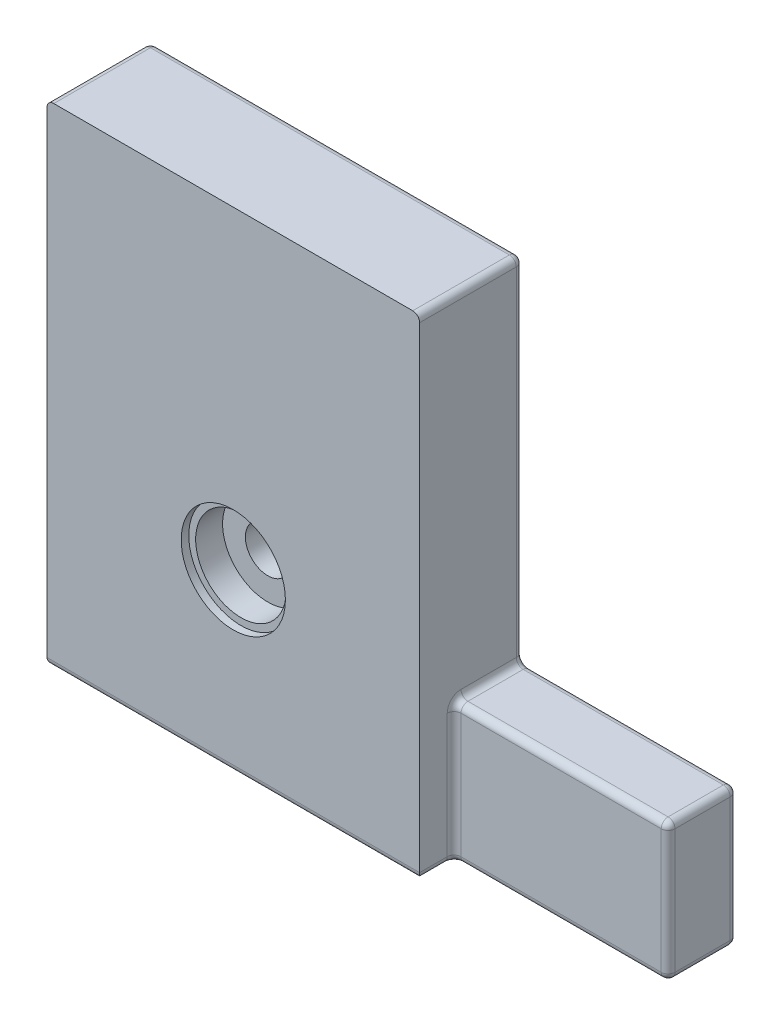
ISO-10303-21;
HEADER;
FILE_DESCRIPTION(('STEP AP214'),'2;1');
FILE_NAME('part.step','',(''),(''),'','','');
FILE_SCHEMA(('AUTOMOTIVE_DESIGN { 1 0 10303 214 1 1 1 1 }'));
ENDSEC;
DATA;
#1=APPLICATION_CONTEXT('core data for automotive mechanical design processes');
#2=APPLICATION_PROTOCOL_DEFINITION('international standard','automotive_design',2000,#1);
#3=PRODUCT_CONTEXT('',#1,'mechanical');
#4=PRODUCT('Part','Part','',(#3));
#5=PRODUCT_RELATED_PRODUCT_CATEGORY('part','',(#4));
#6=PRODUCT_DEFINITION_FORMATION('','',#4);
#7=PRODUCT_DEFINITION_CONTEXT('part definition',#1,'design');
#8=PRODUCT_DEFINITION('design','',#6,#7);
#9=PRODUCT_DEFINITION_SHAPE('','',#8);
#10=(LENGTH_UNIT() NAMED_UNIT(*) SI_UNIT(.MILLI.,.METRE.));
#11=(NAMED_UNIT(*) PLANE_ANGLE_UNIT() SI_UNIT($,.RADIAN.));
#12=(NAMED_UNIT(*) SI_UNIT($,.STERADIAN.) SOLID_ANGLE_UNIT());
#13=UNCERTAINTY_MEASURE_WITH_UNIT(LENGTH_MEASURE(1.E-05),#10,'distance_accuracy_value','');
#14=(GEOMETRIC_REPRESENTATION_CONTEXT(3) GLOBAL_UNCERTAINTY_ASSIGNED_CONTEXT((#13)) GLOBAL_UNIT_ASSIGNED_CONTEXT((#10,
#11,#12)) REPRESENTATION_CONTEXT('',''));
#15=CARTESIAN_POINT('',(0.,0.,0.));
#16=DIRECTION('',(0.,0.,1.));
#17=DIRECTION('',(1.,0.,0.));
#18=AXIS2_PLACEMENT_3D('',#15,#16,#17);
#19=CARTESIAN_POINT('',(30.,-16.5,1.));
#20=DIRECTION('',(1.,0.,0.));
#21=DIRECTION('',(0.,0.,-1.));
#22=AXIS2_PLACEMENT_3D('',#19,#20,#21);
#23=SPHERICAL_SURFACE('',#22,1.);
#24=CARTESIAN_POINT('',(30.,-16.5,0.999999999999999));
#25=DIRECTION('',(0.,0.,-1.));
#26=DIRECTION('',(-1.,0.,0.));
#27=AXIS2_PLACEMENT_3D('',#24,#25,#26);
#28=CIRCLE('',#27,1.);
#29=CARTESIAN_POINT('',(30.,-15.5,0.999999999999999));
#30=VERTEX_POINT('',#29);
#31=CARTESIAN_POINT('',(31.,-16.5,0.999999999999999));
#32=VERTEX_POINT('',#31);
#33=EDGE_CURVE('E282',#30,#32,#28,.T.);
#34=ORIENTED_EDGE('',*,*,#33,.T.);
#35=CARTESIAN_POINT('',(30.,-16.5,0.999999999999999));
#36=DIRECTION('',(0.,1.,0.));
#37=DIRECTION('',(0.,0.,1.));
#38=AXIS2_PLACEMENT_3D('',#35,#36,#37);
#39=CIRCLE('',#38,1.);
#40=CARTESIAN_POINT('',(30.,-16.5,0.));
#41=VERTEX_POINT('',#40);
#42=EDGE_CURVE('E279',#32,#41,#39,.T.);
#43=ORIENTED_EDGE('',*,*,#42,.T.);
#44=CARTESIAN_POINT('',(30.,-16.5,1.));
#45=DIRECTION('',(1.,0.,0.));
#46=DIRECTION('',(0.,0.,-1.));
#47=AXIS2_PLACEMENT_3D('',#44,#45,#46);
#48=CIRCLE('',#47,1.);
#49=EDGE_CURVE('E293',#30,#41,#48,.F.);
#50=ORIENTED_EDGE('',*,*,#49,.F.);
#51=EDGE_LOOP('',(#34,#43,#50));
#52=FACE_BOUND('',#51,.T.);
#53=ADVANCED_FACE('F41',(#52),#23,.T.);
#54=CARTESIAN_POINT('',(30.,-16.5,10.));
#55=DIRECTION('',(0.,0.,-1.));
#56=DIRECTION('',(-1.,0.,0.));
#57=AXIS2_PLACEMENT_3D('',#54,#55,#56);
#58=CYLINDRICAL_SURFACE('',#57,1.);
#59=CARTESIAN_POINT('',(30.,-16.5,9.));
#60=DIRECTION('',(0.,0.,1.));
#61=DIRECTION('',(1.,0.,0.));
#62=AXIS2_PLACEMENT_3D('',#59,#60,#61);
#63=CIRCLE('',#62,1.);
#64=CARTESIAN_POINT('',(31.,-16.5,9.));
#65=VERTEX_POINT('',#64);
#66=CARTESIAN_POINT('',(30.,-15.5,9.));
#67=VERTEX_POINT('',#66);
#68=EDGE_CURVE('E261',#65,#67,#63,.T.);
#69=ORIENTED_EDGE('',*,*,#68,.F.);
#70=DIRECTION('',(0.,0.,-1.));
#71=VECTOR('',#70,1.);
#72=CARTESIAN_POINT('',(31.,-16.5,10.));
#73=LINE('',#72,#71);
#74=EDGE_CURVE('E341',#32,#65,#73,.F.);
#75=ORIENTED_EDGE('',*,*,#74,.F.);
#76=ORIENTED_EDGE('',*,*,#33,.F.);
#77=DIRECTION('',(0.,0.,-1.));
#78=VECTOR('',#77,1.);
#79=CARTESIAN_POINT('',(30.,-15.5,10.));
#80=LINE('',#79,#78);
#81=EDGE_CURVE('E370',#67,#30,#80,.T.);
#82=ORIENTED_EDGE('',*,*,#81,.F.);
#83=EDGE_LOOP('',(#69,#75,#76,#82));
#84=FACE_BOUND('',#83,.T.);
#85=ADVANCED_FACE('F493',(#84),#58,.T.);
#86=CARTESIAN_POINT('',(30.,-16.5,9.));
#87=DIRECTION('',(1.,0.,0.));
#88=DIRECTION('',(0.,0.,-1.));
#89=AXIS2_PLACEMENT_3D('',#86,#87,#88);
#90=SPHERICAL_SURFACE('',#89,1.);
#91=CARTESIAN_POINT('',(30.,-16.5,9.));
#92=DIRECTION('',(0.,1.,0.));
#93=DIRECTION('',(0.,0.,1.));
#94=AXIS2_PLACEMENT_3D('',#91,#92,#93);
#95=CIRCLE('',#94,1.);
#96=CARTESIAN_POINT('',(30.,-16.5,10.));
#97=VERTEX_POINT('',#96);
#98=EDGE_CURVE('E264',#97,#65,#95,.T.);
#99=ORIENTED_EDGE('',*,*,#98,.T.);
#100=ORIENTED_EDGE('',*,*,#68,.T.);
#101=CARTESIAN_POINT('',(30.,-16.5,9.));
#102=DIRECTION('',(1.,0.,0.));
#103=DIRECTION('',(0.,0.,-1.));
#104=AXIS2_PLACEMENT_3D('',#101,#102,#103);
#105=CIRCLE('',#104,1.);
#106=EDGE_CURVE('E285',#97,#67,#105,.F.);
#107=ORIENTED_EDGE('',*,*,#106,.F.);
#108=EDGE_LOOP('',(#99,#100,#107));
#109=FACE_BOUND('',#108,.T.);
#110=ADVANCED_FACE('F504',(#109),#90,.T.);
#111=CARTESIAN_POINT('',(30.,0.,9.));
#112=DIRECTION('',(0.,1.,0.));
#113=DIRECTION('',(-1.,0.,0.));
#114=AXIS2_PLACEMENT_3D('',#111,#112,#113);
#115=CYLINDRICAL_SURFACE('',#114,1.);
#116=CARTESIAN_POINT('',(30.,-34.5,9.));
#117=DIRECTION('',(0.,-1.,0.));
#118=DIRECTION('',(0.,0.,-1.));
#119=AXIS2_PLACEMENT_3D('',#116,#117,#118);
#120=CIRCLE('',#119,1.);
#121=CARTESIAN_POINT('',(30.,-34.5,10.));
#122=VERTEX_POINT('',#121);
#123=CARTESIAN_POINT('',(31.,-34.5,9.));
#124=VERTEX_POINT('',#123);
#125=EDGE_CURVE('E249',#122,#124,#120,.F.);
#126=ORIENTED_EDGE('',*,*,#125,.T.);
#127=DIRECTION('',(0.,1.,0.));
#128=VECTOR('',#127,1.);
#129=CARTESIAN_POINT('',(31.,-15.5,9.));
#130=LINE('',#129,#128);
#131=EDGE_CURVE('E339',#65,#124,#130,.F.);
#132=ORIENTED_EDGE('',*,*,#131,.F.);
#133=ORIENTED_EDGE('',*,*,#98,.F.);
#134=DIRECTION('',(0.,1.,0.));
#135=VECTOR('',#134,1.);
#136=CARTESIAN_POINT('',(30.,0.,10.));
#137=LINE('',#136,#135);
#138=EDGE_CURVE('E361',#122,#97,#137,.T.);
#139=ORIENTED_EDGE('',*,*,#138,.F.);
#140=EDGE_LOOP('',(#126,#132,#133,#139));
#141=FACE_BOUND('',#140,.T.);
#142=ADVANCED_FACE('F507',(#141),#115,.T.);
#143=CARTESIAN_POINT('',(30.,-15.5,0.999999999999999));
#144=DIRECTION('',(0.,-1.,0.));
#145=DIRECTION('',(1.,0.,0.));
#146=AXIS2_PLACEMENT_3D('',#143,#144,#145);
#147=CYLINDRICAL_SURFACE('',#146,1.);
#148=CARTESIAN_POINT('',(30.,-34.5,1.));
#149=DIRECTION('',(0.,-1.,0.));
#150=DIRECTION('',(0.,0.,-1.));
#151=AXIS2_PLACEMENT_3D('',#148,#149,#150);
#152=CIRCLE('',#151,1.);
#153=CARTESIAN_POINT('',(31.,-34.5,0.999999999999999));
#154=VERTEX_POINT('',#153);
#155=CARTESIAN_POINT('',(30.,-34.5,0.));
#156=VERTEX_POINT('',#155);
#157=EDGE_CURVE('E258',#154,#156,#152,.F.);
#158=ORIENTED_EDGE('',*,*,#157,.T.);
#159=DIRECTION('',(0.,1.,0.));
#160=VECTOR('',#159,1.);
#161=CARTESIAN_POINT('',(30.,-35.5,0.));
#162=LINE('',#161,#160);
#163=EDGE_CURVE('E323',#41,#156,#162,.F.);
#164=ORIENTED_EDGE('',*,*,#163,.F.);
#165=ORIENTED_EDGE('',*,*,#42,.F.);
#166=DIRECTION('',(0.,1.,0.));
#167=VECTOR('',#166,1.);
#168=CARTESIAN_POINT('',(31.,-15.5,0.999999999999999));
#169=LINE('',#168,#167);
#170=EDGE_CURVE('E337',#154,#32,#169,.T.);
#171=ORIENTED_EDGE('',*,*,#170,.F.);
#172=EDGE_LOOP('',(#158,#164,#165,#171));
#173=FACE_BOUND('',#172,.T.);
#174=ADVANCED_FACE('F415',(#173),#147,.T.);
#175=CARTESIAN_POINT('',(0.,-16.5,0.999999999999999));
#176=DIRECTION('',(1.,0.,0.));
#177=DIRECTION('',(0.,0.,-1.));
#178=AXIS2_PLACEMENT_3D('',#175,#176,#177);
#179=CYLINDRICAL_SURFACE('',#178,1.);
#180=ORIENTED_EDGE('',*,*,#49,.T.);
#181=DIRECTION('',(-1.,0.,0.));
#182=VECTOR('',#181,1.);
#183=CARTESIAN_POINT('',(31.,-16.5,0.));
#184=LINE('',#183,#182);
#185=CARTESIAN_POINT('',(0.999999999999982,-16.5,0.));
#186=VERTEX_POINT('',#185);
#187=EDGE_CURVE('E319',#186,#41,#184,.F.);
#188=ORIENTED_EDGE('',*,*,#187,.F.);
#189=CARTESIAN_POINT('',(0.999999999999982,-16.5,0.999999999999999));
#190=DIRECTION('',(-1.,0.,0.));
#191=DIRECTION('',(0.,0.,1.));
#192=AXIS2_PLACEMENT_3D('',#189,#190,#191);
#193=CIRCLE('',#192,1.);
#194=CARTESIAN_POINT('',(0.999999999999982,-15.5,0.999999999999999));
#195=VERTEX_POINT('',#194);
#196=EDGE_CURVE('E305',#195,#186,#193,.T.);
#197=ORIENTED_EDGE('',*,*,#196,.F.);
#198=DIRECTION('',(-1.,0.,0.));
#199=VECTOR('',#198,1.);
#200=CARTESIAN_POINT('',(0.,-15.5,0.999999999999999));
#201=LINE('',#200,#199);
#202=EDGE_CURVE('E368',#30,#195,#201,.T.);
#203=ORIENTED_EDGE('',*,*,#202,.F.);
#204=EDGE_LOOP('',(#180,#188,#197,#203));
#205=FACE_BOUND('',#204,.T.);
#206=ADVANCED_FACE('F404',(#205),#179,.T.);
#207=CARTESIAN_POINT('',(-27.,-9.99999999999999,0.));
#208=DIRECTION('',(0.,0.,1.));
#209=DIRECTION('',(1.,0.,0.));
#210=AXIS2_PLACEMENT_3D('',#207,#208,#209);
#211=CYLINDRICAL_SURFACE('',#210,3.25);
#212=CARTESIAN_POINT('',(-27.,-9.99999999999999,10.));
#213=DIRECTION('',(0.,0.,1.));
#214=DIRECTION('',(1.,0.,0.));
#215=AXIS2_PLACEMENT_3D('',#212,#213,#214);
#216=CIRCLE('',#215,3.25);
#217=CARTESIAN_POINT('',(-23.75,-9.99999999999999,10.));
#218=VERTEX_POINT('',#217);
#219=EDGE_CURVE('E216',#218,#218,#216,.T.);
#220=ORIENTED_EDGE('',*,*,#219,.T.);
#221=EDGE_LOOP('',(#220));
#222=FACE_BOUND('',#221,.T.);
#223=CARTESIAN_POINT('',(-27.,-9.99999999999999,0.));
#224=DIRECTION('',(0.,0.,1.));
#225=DIRECTION('',(1.,0.,0.));
#226=AXIS2_PLACEMENT_3D('',#223,#224,#225);
#227=CIRCLE('',#226,3.25);
#228=CARTESIAN_POINT('',(-23.75,-9.99999999999999,0.));
#229=VERTEX_POINT('',#228);
#230=EDGE_CURVE('E220',#229,#229,#227,.T.);
#231=ORIENTED_EDGE('',*,*,#230,.F.);
#232=EDGE_LOOP('',(#231));
#233=FACE_BOUND('',#232,.T.);
#234=ADVANCED_FACE('F401',(#222,#233),#211,.F.);
#235=CARTESIAN_POINT('',(31.,-15.5,10.));
#236=DIRECTION('',(-1.,0.,0.));
#237=DIRECTION('',(0.,-1.,0.));
#238=AXIS2_PLACEMENT_3D('',#235,#236,#237);
#239=PLANE('',#238);
#240=ORIENTED_EDGE('',*,*,#131,.T.);
#241=DIRECTION('',(0.,0.,-1.));
#242=VECTOR('',#241,1.);
#243=CARTESIAN_POINT('',(31.,-34.5,10.));
#244=LINE('',#243,#242);
#245=EDGE_CURVE('E334',#124,#154,#244,.T.);
#246=ORIENTED_EDGE('',*,*,#245,.T.);
#247=ORIENTED_EDGE('',*,*,#170,.T.);
#248=ORIENTED_EDGE('',*,*,#74,.T.);
#249=EDGE_LOOP('',(#240,#246,#247,#248));
#250=FACE_BOUND('',#249,.T.);
#251=ADVANCED_FACE('F403',(#250),#239,.F.);
#252=CARTESIAN_POINT('',(30.,-34.5,9.));
#253=DIRECTION('',(1.,0.,0.));
#254=DIRECTION('',(0.,0.,-1.));
#255=AXIS2_PLACEMENT_3D('',#252,#253,#254);
#256=SPHERICAL_SURFACE('',#255,1.);
#257=CARTESIAN_POINT('',(30.,-34.5,9.));
#258=DIRECTION('',(1.,0.,0.));
#259=DIRECTION('',(0.,0.,-1.));
#260=AXIS2_PLACEMENT_3D('',#257,#258,#259);
#261=CIRCLE('',#260,1.);
#262=CARTESIAN_POINT('',(30.,-35.5,9.));
#263=VERTEX_POINT('',#262);
#264=EDGE_CURVE('E252',#263,#122,#261,.F.);
#265=ORIENTED_EDGE('',*,*,#264,.F.);
#266=CARTESIAN_POINT('',(30.,-34.5,9.));
#267=DIRECTION('',(0.,0.,1.));
#268=DIRECTION('',(1.,0.,0.));
#269=AXIS2_PLACEMENT_3D('',#266,#267,#268);
#270=CIRCLE('',#269,1.);
#271=EDGE_CURVE('E234',#263,#124,#270,.T.);
#272=ORIENTED_EDGE('',*,*,#271,.T.);
#273=ORIENTED_EDGE('',*,*,#125,.F.);
#274=EDGE_LOOP('',(#265,#272,#273));
#275=FACE_BOUND('',#274,.T.);
#276=ADVANCED_FACE('F412',(#275),#256,.T.);
#277=CARTESIAN_POINT('',(30.,-34.5,1.));
#278=DIRECTION('',(0.,-1.,0.));
#279=DIRECTION('',(0.,0.,-1.));
#280=AXIS2_PLACEMENT_3D('',#277,#278,#279);
#281=SPHERICAL_SURFACE('',#280,1.);
#282=CARTESIAN_POINT('',(30.,-34.5,0.999999999999999));
#283=DIRECTION('',(0.,0.,-1.));
#284=DIRECTION('',(-1.,0.,0.));
#285=AXIS2_PLACEMENT_3D('',#282,#283,#284);
#286=CIRCLE('',#285,1.);
#287=CARTESIAN_POINT('',(30.,-35.5,0.999999999999999));
#288=VERTEX_POINT('',#287);
#289=EDGE_CURVE('E246',#154,#288,#286,.T.);
#290=ORIENTED_EDGE('',*,*,#289,.T.);
#291=CARTESIAN_POINT('',(30.,-34.5,0.999999999999999));
#292=DIRECTION('',(1.,0.,0.));
#293=DIRECTION('',(0.,0.,-1.));
#294=AXIS2_PLACEMENT_3D('',#291,#292,#293);
#295=CIRCLE('',#294,1.);
#296=EDGE_CURVE('E243',#288,#156,#295,.T.);
#297=ORIENTED_EDGE('',*,*,#296,.T.);
#298=ORIENTED_EDGE('',*,*,#157,.F.);
#299=EDGE_LOOP('',(#290,#297,#298));
#300=FACE_BOUND('',#299,.T.);
#301=ADVANCED_FACE('F477',(#300),#281,.T.);
#302=CARTESIAN_POINT('',(0.999999999999982,-14.5,0.999999999999999));
#303=DIRECTION('',(0.,0.,-1.));
#304=DIRECTION('',(-1.,0.,0.));
#305=AXIS2_PLACEMENT_3D('',#302,#303,#304);
#306=TOROIDAL_SURFACE('',#305,2.,1.);
#307=CARTESIAN_POINT('',(0.999999999999982,-14.5,0.));
#308=DIRECTION('',(0.,0.,-1.));
#309=DIRECTION('',(-1.,0.,0.));
#310=AXIS2_PLACEMENT_3D('',#307,#308,#309);
#311=CIRCLE('',#310,2.);
#312=CARTESIAN_POINT('',(-1.00000000000002,-14.5,0.));
#313=VERTEX_POINT('',#312);
#314=EDGE_CURVE('E321',#186,#313,#311,.T.);
#315=ORIENTED_EDGE('',*,*,#314,.T.);
#316=CARTESIAN_POINT('',(-1.00000000000002,-14.5,1.));
#317=DIRECTION('',(0.,-1.,0.));
#318=DIRECTION('',(0.,0.,-1.));
#319=AXIS2_PLACEMENT_3D('',#316,#317,#318);
#320=CIRCLE('',#319,1.);
#321=CARTESIAN_POINT('',(0.,-14.5,0.999999999999999));
#322=VERTEX_POINT('',#321);
#323=EDGE_CURVE('E302',#313,#322,#320,.T.);
#324=ORIENTED_EDGE('',*,*,#323,.T.);
#325=CARTESIAN_POINT('',(0.999999999999982,-14.5,0.999999999999999));
#326=DIRECTION('',(0.,0.,-1.));
#327=DIRECTION('',(-1.,0.,0.));
#328=AXIS2_PLACEMENT_3D('',#325,#326,#327);
#329=CIRCLE('',#328,1.);
#330=EDGE_CURVE('E310',#195,#322,#329,.T.);
#331=ORIENTED_EDGE('',*,*,#330,.F.);
#332=ORIENTED_EDGE('',*,*,#196,.T.);
#333=EDGE_LOOP('',(#315,#324,#331,#332));
#334=FACE_BOUND('',#333,.T.);
#335=ADVANCED_FACE('F467',(#334),#306,.T.);
#336=CARTESIAN_POINT('',(0.,-15.5,10.));
#337=DIRECTION('',(0.,-1.,0.));
#338=DIRECTION('',(0.,0.,-1.));
#339=AXIS2_PLACEMENT_3D('',#336,#337,#338);
#340=PLANE('',#339);
#341=ORIENTED_EDGE('',*,*,#202,.T.);
#342=DIRECTION('',(0.,0.,-1.));
#343=VECTOR('',#342,1.);
#344=CARTESIAN_POINT('',(0.999999999999982,-15.5,10.));
#345=LINE('',#344,#343);
#346=CARTESIAN_POINT('',(0.999999999999982,-15.5,9.));
#347=VERTEX_POINT('',#346);
#348=EDGE_CURVE('E365',#195,#347,#345,.F.);
#349=ORIENTED_EDGE('',*,*,#348,.T.);
#350=DIRECTION('',(-1.,0.,0.));
#351=VECTOR('',#350,1.);
#352=CARTESIAN_POINT('',(0.,-15.5,9.));
#353=LINE('',#352,#351);
#354=EDGE_CURVE('E372',#347,#67,#353,.F.);
#355=ORIENTED_EDGE('',*,*,#354,.T.);
#356=ORIENTED_EDGE('',*,*,#81,.T.);
#357=EDGE_LOOP('',(#341,#349,#355,#356));
#358=FACE_BOUND('',#357,.T.);
#359=ADVANCED_FACE('F464',(#358),#340,.F.);
#360=CARTESIAN_POINT('',(0.,-16.5,9.));
#361=DIRECTION('',(-1.,0.,0.));
#362=DIRECTION('',(0.,0.,1.));
#363=AXIS2_PLACEMENT_3D('',#360,#361,#362);
#364=CYLINDRICAL_SURFACE('',#363,1.);
#365=ORIENTED_EDGE('',*,*,#106,.T.);
#366=ORIENTED_EDGE('',*,*,#354,.F.);
#367=CARTESIAN_POINT('',(0.999999999999981,-16.5,9.));
#368=DIRECTION('',(-1.,0.,0.));
#369=DIRECTION('',(0.,-1.,0.));
#370=AXIS2_PLACEMENT_3D('',#367,#368,#369);
#371=CIRCLE('',#370,1.);
#372=CARTESIAN_POINT('',(0.999999999999981,-16.5,10.));
#373=VERTEX_POINT('',#372);
#374=EDGE_CURVE('E296',#373,#347,#371,.T.);
#375=ORIENTED_EDGE('',*,*,#374,.F.);
#376=DIRECTION('',(-1.,0.,0.));
#377=VECTOR('',#376,1.);
#378=CARTESIAN_POINT('',(0.,-16.5,10.));
#379=LINE('',#378,#377);
#380=EDGE_CURVE('E363',#97,#373,#379,.T.);
#381=ORIENTED_EDGE('',*,*,#380,.F.);
#382=EDGE_LOOP('',(#365,#366,#375,#381));
#383=FACE_BOUND('',#382,.T.);
#384=ADVANCED_FACE('F441',(#383),#364,.T.);
#385=CARTESIAN_POINT('',(0.,0.,10.));
#386=DIRECTION('',(0.,0.,-1.));
#387=DIRECTION('',(-1.,0.,0.));
#388=AXIS2_PLACEMENT_3D('',#385,#386,#387);
#389=PLANE('',#388);
#390=ORIENTED_EDGE('',*,*,#380,.T.);
#391=DIRECTION('',(0.,1.,0.));
#392=VECTOR('',#391,1.);
#393=CARTESIAN_POINT('',(0.999999999999974,-35.5,10.));
#394=LINE('',#393,#392);
#395=CARTESIAN_POINT('',(0.999999999999974,-34.5,10.));
#396=VERTEX_POINT('',#395);
#397=EDGE_CURVE('E356',#373,#396,#394,.F.);
#398=ORIENTED_EDGE('',*,*,#397,.T.);
#399=DIRECTION('',(1.,0.,0.));
#400=VECTOR('',#399,1.);
#401=CARTESIAN_POINT('',(0.,-34.5,10.));
#402=LINE('',#401,#400);
#403=EDGE_CURVE('E359',#396,#122,#402,.T.);
#404=ORIENTED_EDGE('',*,*,#403,.T.);
#405=ORIENTED_EDGE('',*,*,#138,.T.);
#406=EDGE_LOOP('',(#390,#398,#404,#405));
#407=FACE_BOUND('',#406,.T.);
#408=ADVANCED_FACE('F438',(#407),#389,.F.);
#409=CARTESIAN_POINT('',(0.,0.,0.));
#410=DIRECTION('',(0.,0.,-1.));
#411=DIRECTION('',(-1.,0.,0.));
#412=AXIS2_PLACEMENT_3D('',#409,#410,#411);
#413=PLANE('',#412);
#414=ORIENTED_EDGE('',*,*,#230,.T.);
#415=EDGE_LOOP('',(#414));
#416=FACE_BOUND('',#415,.T.);
#417=ORIENTED_EDGE('',*,*,#314,.F.);
#418=ORIENTED_EDGE('',*,*,#187,.T.);
#419=ORIENTED_EDGE('',*,*,#163,.T.);
#420=DIRECTION('',(1.,0.,0.));
#421=VECTOR('',#420,1.);
#422=CARTESIAN_POINT('',(-54.,-34.5,0.));
#423=LINE('',#422,#421);
#424=CARTESIAN_POINT('',(-53.,-34.5,0.));
#425=VERTEX_POINT('',#424);
#426=EDGE_CURVE('E328',#156,#425,#423,.F.);
#427=ORIENTED_EDGE('',*,*,#426,.T.);
#428=DIRECTION('',(0.,-1.,0.));
#429=VECTOR('',#428,1.);
#430=CARTESIAN_POINT('',(-53.,35.5,0.));
#431=LINE('',#430,#429);
#432=CARTESIAN_POINT('',(-53.,34.5,0.));
#433=VERTEX_POINT('',#432);
#434=EDGE_CURVE('E330',#425,#433,#431,.F.);
#435=ORIENTED_EDGE('',*,*,#434,.T.);
#436=DIRECTION('',(-1.,0.,0.));
#437=VECTOR('',#436,1.);
#438=CARTESIAN_POINT('',(0.,34.5,0.));
#439=LINE('',#438,#437);
#440=CARTESIAN_POINT('',(-1.,34.5,0.));
#441=VERTEX_POINT('',#440);
#442=EDGE_CURVE('E332',#433,#441,#439,.F.);
#443=ORIENTED_EDGE('',*,*,#442,.T.);
#444=DIRECTION('',(0.,1.,0.));
#445=VECTOR('',#444,1.);
#446=CARTESIAN_POINT('',(-1.00000000000002,-15.5,0.));
#447=LINE('',#446,#445);
#448=EDGE_CURVE('E325',#441,#313,#447,.F.);
#449=ORIENTED_EDGE('',*,*,#448,.T.);
#450=EDGE_LOOP('',(#417,#418,#419,#427,#435,#443,#449));
#451=FACE_BOUND('',#450,.T.);
#452=ADVANCED_FACE('F398',(#416,#451),#413,.T.);
#453=CARTESIAN_POINT('',(0.,-34.5,9.));
#454=DIRECTION('',(1.,0.,0.));
#455=DIRECTION('',(0.,1.,0.));
#456=AXIS2_PLACEMENT_3D('',#453,#454,#455);
#457=CYLINDRICAL_SURFACE('',#456,1.);
#458=ORIENTED_EDGE('',*,*,#264,.T.);
#459=ORIENTED_EDGE('',*,*,#403,.F.);
#460=CARTESIAN_POINT('',(0.999999999999974,-34.5,9.));
#461=DIRECTION('',(-1.,0.,0.));
#462=DIRECTION('',(0.,-1.,0.));
#463=AXIS2_PLACEMENT_3D('',#460,#461,#462);
#464=CIRCLE('',#463,1.);
#465=CARTESIAN_POINT('',(0.999999999999974,-35.5,9.));
#466=VERTEX_POINT('',#465);
#467=EDGE_CURVE('E267',#466,#396,#464,.T.);
#468=ORIENTED_EDGE('',*,*,#467,.F.);
#469=DIRECTION('',(1.,0.,0.));
#470=VECTOR('',#469,1.);
#471=CARTESIAN_POINT('',(31.,-35.5,9.));
#472=LINE('',#471,#470);
#473=EDGE_CURVE('E349',#263,#466,#472,.F.);
#474=ORIENTED_EDGE('',*,*,#473,.F.);
#475=EDGE_LOOP('',(#458,#459,#468,#474));
#476=FACE_BOUND('',#475,.T.);
#477=ADVANCED_FACE('F444',(#476),#457,.T.);
#478=CARTESIAN_POINT('',(30.,-34.5,10.));
#479=DIRECTION('',(0.,0.,-1.));
#480=DIRECTION('',(-1.,0.,0.));
#481=AXIS2_PLACEMENT_3D('',#478,#479,#480);
#482=CYLINDRICAL_SURFACE('',#481,1.);
#483=ORIENTED_EDGE('',*,*,#271,.F.);
#484=DIRECTION('',(0.,0.,-1.));
#485=VECTOR('',#484,1.);
#486=CARTESIAN_POINT('',(30.,-35.5,10.));
#487=LINE('',#486,#485);
#488=EDGE_CURVE('E351',#288,#263,#487,.F.);
#489=ORIENTED_EDGE('',*,*,#488,.F.);
#490=ORIENTED_EDGE('',*,*,#289,.F.);
#491=ORIENTED_EDGE('',*,*,#245,.F.);
#492=EDGE_LOOP('',(#483,#489,#490,#491));
#493=FACE_BOUND('',#492,.T.);
#494=ADVANCED_FACE('F527',(#493),#482,.T.);
#495=CARTESIAN_POINT('',(31.,-34.5,0.999999999999999));
#496=DIRECTION('',(-1.,0.,0.));
#497=DIRECTION('',(0.,-1.,0.));
#498=AXIS2_PLACEMENT_3D('',#495,#496,#497);
#499=CYLINDRICAL_SURFACE('',#498,1.);
#500=CARTESIAN_POINT('',(-53.,-34.5,1.));
#501=DIRECTION('',(-1.,0.,0.));
#502=DIRECTION('',(0.,-1.,0.));
#503=AXIS2_PLACEMENT_3D('',#500,#501,#502);
#504=CIRCLE('',#503,1.);
#505=CARTESIAN_POINT('',(-53.,-35.5,0.999999999999999));
#506=VERTEX_POINT('',#505);
#507=EDGE_CURVE('E231',#506,#425,#504,.F.);
#508=ORIENTED_EDGE('',*,*,#507,.T.);
#509=ORIENTED_EDGE('',*,*,#426,.F.);
#510=ORIENTED_EDGE('',*,*,#296,.F.);
#511=DIRECTION('',(1.,0.,0.));
#512=VECTOR('',#511,1.);
#513=CARTESIAN_POINT('',(31.,-35.5,0.999999999999999));
#514=LINE('',#513,#512);
#515=EDGE_CURVE('E353',#506,#288,#514,.T.);
#516=ORIENTED_EDGE('',*,*,#515,.F.);
#517=EDGE_LOOP('',(#508,#509,#510,#516));
#518=FACE_BOUND('',#517,.T.);
#519=ADVANCED_FACE('F543',(#518),#499,.T.);
#520=CARTESIAN_POINT('',(-53.,-34.5,1.));
#521=DIRECTION('',(-1.,0.,0.));
#522=DIRECTION('',(0.,0.,1.));
#523=AXIS2_PLACEMENT_3D('',#520,#521,#522);
#524=SPHERICAL_SURFACE('',#523,1.);
#525=ORIENTED_EDGE('',*,*,#507,.F.);
#526=CARTESIAN_POINT('',(-53.,-34.5,0.999999999999999));
#527=DIRECTION('',(0.,0.,-1.));
#528=DIRECTION('',(-1.,0.,0.));
#529=AXIS2_PLACEMENT_3D('',#526,#527,#528);
#530=CIRCLE('',#529,1.);
#531=CARTESIAN_POINT('',(-54.,-34.5,0.999999999999999));
#532=VERTEX_POINT('',#531);
#533=EDGE_CURVE('E225',#506,#532,#530,.T.);
#534=ORIENTED_EDGE('',*,*,#533,.T.);
#535=CARTESIAN_POINT('',(-53.,-34.5,0.999999999999999));
#536=DIRECTION('',(0.,-1.,0.));
#537=DIRECTION('',(0.,0.,-1.));
#538=AXIS2_PLACEMENT_3D('',#535,#536,#537);
#539=CIRCLE('',#538,1.);
#540=EDGE_CURVE('E228',#425,#532,#539,.F.);
#541=ORIENTED_EDGE('',*,*,#540,.F.);
#542=EDGE_LOOP('',(#525,#534,#541));
#543=FACE_BOUND('',#542,.T.);
#544=ADVANCED_FACE('F502',(#543),#524,.T.);
#545=CARTESIAN_POINT('',(0.999999999999974,-34.5,11.));
#546=DIRECTION('',(0.,1.,0.));
#547=DIRECTION('',(-1.,0.,0.));
#548=AXIS2_PLACEMENT_3D('',#545,#546,#547);
#549=TOROIDAL_SURFACE('',#548,2.,1.);
#550=CARTESIAN_POINT('',(0.999999999999974,-35.5,11.));
#551=DIRECTION('',(0.,1.,0.));
#552=DIRECTION('',(-1.,0.,0.));
#553=AXIS2_PLACEMENT_3D('',#550,#551,#552);
#554=CIRCLE('',#553,2.);
#555=CARTESIAN_POINT('',(-1.00000000000003,-35.5,11.));
#556=VERTEX_POINT('',#555);
#557=EDGE_CURVE('E346',#556,#466,#554,.F.);
#558=ORIENTED_EDGE('',*,*,#557,.T.);
#559=ORIENTED_EDGE('',*,*,#467,.T.);
#560=CARTESIAN_POINT('',(0.999999999999974,-34.5,11.));
#561=DIRECTION('',(0.,1.,0.));
#562=DIRECTION('',(-1.,0.,0.));
#563=AXIS2_PLACEMENT_3D('',#560,#561,#562);
#564=CIRCLE('',#563,1.);
#565=CARTESIAN_POINT('',(0.,-34.5,11.));
#566=VERTEX_POINT('',#565);
#567=EDGE_CURVE('E288',#566,#396,#564,.F.);
#568=ORIENTED_EDGE('',*,*,#567,.F.);
#569=CARTESIAN_POINT('',(-1.00000000000003,-34.5,11.));
#570=DIRECTION('',(0.,0.,-1.));
#571=DIRECTION('',(-1.,0.,0.));
#572=AXIS2_PLACEMENT_3D('',#569,#570,#571);
#573=CIRCLE('',#572,1.);
#574=EDGE_CURVE('E270',#566,#556,#573,.T.);
#575=ORIENTED_EDGE('',*,*,#574,.T.);
#576=EDGE_LOOP('',(#558,#559,#568,#575));
#577=FACE_BOUND('',#576,.T.);
#578=ADVANCED_FACE('F498',(#577),#549,.T.);
#579=CARTESIAN_POINT('',(0.,34.5,0.999999999999999));
#580=DIRECTION('',(1.,0.,0.));
#581=DIRECTION('',(0.,1.,0.));
#582=AXIS2_PLACEMENT_3D('',#579,#580,#581);
#583=CYLINDRICAL_SURFACE('',#582,1.);
#584=CARTESIAN_POINT('',(-53.,34.5,0.999999999999999));
#585=DIRECTION('',(-1.,0.,0.));
#586=DIRECTION('',(0.,0.,1.));
#587=AXIS2_PLACEMENT_3D('',#584,#585,#586);
#588=CIRCLE('',#587,1.);
#589=CARTESIAN_POINT('',(-53.,35.5,0.999999999999999));
#590=VERTEX_POINT('',#589);
#591=EDGE_CURVE('E255',#433,#590,#588,.F.);
#592=ORIENTED_EDGE('',*,*,#591,.T.);
#593=DIRECTION('',(-1.,0.,0.));
#594=VECTOR('',#593,1.);
#595=CARTESIAN_POINT('',(-54.,35.5,0.999999999999999));
#596=LINE('',#595,#594);
#597=CARTESIAN_POINT('',(-1.,35.5,0.999999999999999));
#598=VERTEX_POINT('',#597);
#599=EDGE_CURVE('E206',#598,#590,#596,.T.);
#600=ORIENTED_EDGE('',*,*,#599,.F.);
#601=CARTESIAN_POINT('',(-1.,34.5,1.));
#602=DIRECTION('',(1.,0.,0.));
#603=DIRECTION('',(0.,1.,0.));
#604=AXIS2_PLACEMENT_3D('',#601,#602,#603);
#605=CIRCLE('',#604,1.);
#606=EDGE_CURVE('E276',#441,#598,#605,.T.);
#607=ORIENTED_EDGE('',*,*,#606,.F.);
#608=ORIENTED_EDGE('',*,*,#442,.F.);
#609=EDGE_LOOP('',(#592,#600,#607,#608));
#610=FACE_BOUND('',#609,.T.);
#611=ADVANCED_FACE('F501',(#610),#583,.T.);
#612=CARTESIAN_POINT('',(-53.,34.5,1.));
#613=DIRECTION('',(-1.,0.,0.));
#614=DIRECTION('',(0.,0.,1.));
#615=AXIS2_PLACEMENT_3D('',#612,#613,#614);
#616=SPHERICAL_SURFACE('',#615,1.);
#617=CARTESIAN_POINT('',(-53.,34.5,1.));
#618=DIRECTION('',(0.,1.,0.));
#619=DIRECTION('',(0.,0.,1.));
#620=AXIS2_PLACEMENT_3D('',#617,#618,#619);
#621=CIRCLE('',#620,1.);
#622=CARTESIAN_POINT('',(-54.,34.5,0.999999999999999));
#623=VERTEX_POINT('',#622);
#624=EDGE_CURVE('E240',#433,#623,#621,.T.);
#625=ORIENTED_EDGE('',*,*,#624,.T.);
#626=CARTESIAN_POINT('',(-53.,34.5,0.999999999999999));
#627=DIRECTION('',(0.,0.,-1.));
#628=DIRECTION('',(-1.,0.,0.));
#629=AXIS2_PLACEMENT_3D('',#626,#627,#628);
#630=CIRCLE('',#629,1.);
#631=EDGE_CURVE('E237',#623,#590,#630,.T.);
#632=ORIENTED_EDGE('',*,*,#631,.T.);
#633=ORIENTED_EDGE('',*,*,#591,.F.);
#634=EDGE_LOOP('',(#625,#632,#633));
#635=FACE_BOUND('',#634,.T.);
#636=ADVANCED_FACE('F459',(#635),#616,.T.);
#637=CARTESIAN_POINT('',(0.,35.5,10.));
#638=DIRECTION('',(0.,-1.,0.));
#639=DIRECTION('',(1.,0.,0.));
#640=AXIS2_PLACEMENT_3D('',#637,#638,#639);
#641=PLANE('',#640);
#642=DIRECTION('',(0.,0.,-1.));
#643=VECTOR('',#642,1.);
#644=CARTESIAN_POINT('',(-53.,35.5,10.));
#645=LINE('',#644,#643);
#646=CARTESIAN_POINT('',(-53.,35.5,15.));
#647=VERTEX_POINT('',#646);
#648=EDGE_CURVE('E313',#590,#647,#645,.F.);
#649=ORIENTED_EDGE('',*,*,#648,.T.);
#650=DIRECTION('',(1.,0.,0.));
#651=VECTOR('',#650,1.);
#652=CARTESIAN_POINT('',(0.,35.5,15.));
#653=LINE('',#652,#651);
#654=CARTESIAN_POINT('',(-1.,35.5,15.));
#655=VERTEX_POINT('',#654);
#656=EDGE_CURVE('E63',#647,#655,#653,.T.);
#657=ORIENTED_EDGE('',*,*,#656,.T.);
#658=DIRECTION('',(0.,0.,-1.));
#659=VECTOR('',#658,1.);
#660=CARTESIAN_POINT('',(-1.,35.5,10.));
#661=LINE('',#660,#659);
#662=EDGE_CURVE('E215',#655,#598,#661,.T.);
#663=ORIENTED_EDGE('',*,*,#662,.T.);
#664=ORIENTED_EDGE('',*,*,#599,.T.);
#665=EDGE_LOOP('',(#649,#657,#663,#664));
#666=FACE_BOUND('',#665,.T.);
#667=ADVANCED_FACE('F455',(#666),#641,.F.);
#668=CARTESIAN_POINT('',(-1.,34.5,1.));
#669=DIRECTION('',(0.,1.,0.));
#670=DIRECTION('',(0.,0.,1.));
#671=AXIS2_PLACEMENT_3D('',#668,#669,#670);
#672=SPHERICAL_SURFACE('',#671,1.);
#673=ORIENTED_EDGE('',*,*,#606,.T.);
#674=CARTESIAN_POINT('',(-1.,34.5,0.999999999999999));
#675=DIRECTION('',(0.,0.,-1.));
#676=DIRECTION('',(-1.,0.,0.));
#677=AXIS2_PLACEMENT_3D('',#674,#675,#676);
#678=CIRCLE('',#677,1.);
#679=CARTESIAN_POINT('',(0.,34.5,0.999999999999999));
#680=VERTEX_POINT('',#679);
#681=EDGE_CURVE('E273',#598,#680,#678,.T.);
#682=ORIENTED_EDGE('',*,*,#681,.T.);
#683=CARTESIAN_POINT('',(-1.,34.5,0.999999999999999));
#684=DIRECTION('',(0.,1.,0.));
#685=DIRECTION('',(0.,0.,1.));
#686=AXIS2_PLACEMENT_3D('',#683,#684,#685);
#687=CIRCLE('',#686,1.);
#688=EDGE_CURVE('E290',#441,#680,#687,.F.);
#689=ORIENTED_EDGE('',*,*,#688,.F.);
#690=EDGE_LOOP('',(#673,#682,#689));
#691=FACE_BOUND('',#690,.T.);
#692=ADVANCED_FACE('F458',(#691),#672,.T.);
#693=CARTESIAN_POINT('',(-1.00000000000001,15.5,0.999999999999999));
#694=DIRECTION('',(0.,-1.,0.));
#695=DIRECTION('',(1.,0.,0.));
#696=AXIS2_PLACEMENT_3D('',#693,#694,#695);
#697=CYLINDRICAL_SURFACE('',#696,1.);
#698=ORIENTED_EDGE('',*,*,#688,.T.);
#699=DIRECTION('',(0.,1.,0.));
#700=VECTOR('',#699,1.);
#701=CARTESIAN_POINT('',(0.,35.5,0.999999999999999));
#702=LINE('',#701,#700);
#703=EDGE_CURVE('E384',#322,#680,#702,.T.);
#704=ORIENTED_EDGE('',*,*,#703,.F.);
#705=ORIENTED_EDGE('',*,*,#323,.F.);
#706=ORIENTED_EDGE('',*,*,#448,.F.);
#707=EDGE_LOOP('',(#698,#704,#705,#706));
#708=FACE_BOUND('',#707,.T.);
#709=ADVANCED_FACE('F473',(#708),#697,.T.);
#710=CARTESIAN_POINT('',(0.999999999999982,-14.5,10.));
#711=DIRECTION('',(0.,0.,1.));
#712=DIRECTION('',(1.,0.,0.));
#713=AXIS2_PLACEMENT_3D('',#710,#711,#712);
#714=CYLINDRICAL_SURFACE('',#713,1.);
#715=CARTESIAN_POINT('',(0.999999999999982,-14.5,9.));
#716=DIRECTION('',(0.,0.,-1.));
#717=DIRECTION('',(-1.,0.,0.));
#718=AXIS2_PLACEMENT_3D('',#715,#716,#717);
#719=CIRCLE('',#718,1.);
#720=CARTESIAN_POINT('',(0.,-14.5,9.));
#721=VERTEX_POINT('',#720);
#722=EDGE_CURVE('E308',#721,#347,#719,.F.);
#723=ORIENTED_EDGE('',*,*,#722,.T.);
#724=ORIENTED_EDGE('',*,*,#348,.F.);
#725=ORIENTED_EDGE('',*,*,#330,.T.);
#726=DIRECTION('',(0.,0.,-1.));
#727=VECTOR('',#726,1.);
#728=CARTESIAN_POINT('',(0.,-14.5,0.));
#729=LINE('',#728,#727);
#730=EDGE_CURVE('E381',#721,#322,#729,.T.);
#731=ORIENTED_EDGE('',*,*,#730,.F.);
#732=EDGE_LOOP('',(#723,#724,#725,#731));
#733=FACE_BOUND('',#732,.T.);
#734=ADVANCED_FACE('F469',(#733),#714,.F.);
#735=CARTESIAN_POINT('',(0.999999999999981,-16.5,9.));
#736=DIRECTION('',(-1.,0.,0.));
#737=DIRECTION('',(0.,-1.,0.));
#738=AXIS2_PLACEMENT_3D('',#735,#736,#737);
#739=TOROIDAL_SURFACE('',#738,2.,1.);
#740=CARTESIAN_POINT('',(0.999999999999981,-16.5,11.));
#741=DIRECTION('',(0.,-1.,0.));
#742=DIRECTION('',(0.,0.,-1.));
#743=AXIS2_PLACEMENT_3D('',#740,#741,#742);
#744=CIRCLE('',#743,1.);
#745=CARTESIAN_POINT('',(0.,-16.5,11.));
#746=VERTEX_POINT('',#745);
#747=EDGE_CURVE('E299',#746,#373,#744,.T.);
#748=ORIENTED_EDGE('',*,*,#747,.T.);
#749=ORIENTED_EDGE('',*,*,#374,.T.);
#750=ORIENTED_EDGE('',*,*,#722,.F.);
#751=CARTESIAN_POINT('',(0.,-16.5,9.));
#752=DIRECTION('',(-1.,0.,0.));
#753=DIRECTION('',(0.,-1.,0.));
#754=AXIS2_PLACEMENT_3D('',#751,#752,#753);
#755=CIRCLE('',#754,2.);
#756=EDGE_CURVE('E378',#721,#746,#755,.F.);
#757=ORIENTED_EDGE('',*,*,#756,.T.);
#758=EDGE_LOOP('',(#748,#749,#750,#757));
#759=FACE_BOUND('',#758,.T.);
#760=ADVANCED_FACE('F472',(#759),#739,.F.);
#761=CARTESIAN_POINT('',(0.999999999999993,15.5,11.));
#762=DIRECTION('',(0.,-1.,0.));
#763=DIRECTION('',(1.,0.,0.));
#764=AXIS2_PLACEMENT_3D('',#761,#762,#763);
#765=CYLINDRICAL_SURFACE('',#764,1.);
#766=ORIENTED_EDGE('',*,*,#567,.T.);
#767=ORIENTED_EDGE('',*,*,#397,.F.);
#768=ORIENTED_EDGE('',*,*,#747,.F.);
#769=DIRECTION('',(0.,1.,0.));
#770=VECTOR('',#769,1.);
#771=CARTESIAN_POINT('',(0.,-15.5,11.));
#772=LINE('',#771,#770);
#773=EDGE_CURVE('E376',#566,#746,#772,.T.);
#774=ORIENTED_EDGE('',*,*,#773,.F.);
#775=EDGE_LOOP('',(#766,#767,#768,#774));
#776=FACE_BOUND('',#775,.T.);
#777=ADVANCED_FACE('F449',(#776),#765,.F.);
#778=CARTESIAN_POINT('',(31.,-35.5,10.));
#779=DIRECTION('',(0.,1.,0.));
#780=DIRECTION('',(-1.,0.,0.));
#781=AXIS2_PLACEMENT_3D('',#778,#779,#780);
#782=PLANE('',#781);
#783=DIRECTION('',(0.,0.,-1.));
#784=VECTOR('',#783,1.);
#785=CARTESIAN_POINT('',(-1.00000000000003,-35.5,10.));
#786=LINE('',#785,#784);
#787=CARTESIAN_POINT('',(-1.00000000000003,-35.5,14.));
#788=VERTEX_POINT('',#787);
#789=EDGE_CURVE('E343',#556,#788,#786,.F.);
#790=ORIENTED_EDGE('',*,*,#789,.T.);
#791=DIRECTION('',(-1.,0.,0.));
#792=VECTOR('',#791,1.);
#793=CARTESIAN_POINT('',(31.,-35.5,14.));
#794=LINE('',#793,#792);
#795=CARTESIAN_POINT('',(-53.,-35.5,14.));
#796=VERTEX_POINT('',#795);
#797=EDGE_CURVE('E193',#788,#796,#794,.T.);
#798=ORIENTED_EDGE('',*,*,#797,.T.);
#799=DIRECTION('',(0.,0.,-1.));
#800=VECTOR('',#799,1.);
#801=CARTESIAN_POINT('',(-53.,-35.5,10.));
#802=LINE('',#801,#800);
#803=EDGE_CURVE('E187',#796,#506,#802,.T.);
#804=ORIENTED_EDGE('',*,*,#803,.T.);
#805=ORIENTED_EDGE('',*,*,#515,.T.);
#806=ORIENTED_EDGE('',*,*,#488,.T.);
#807=ORIENTED_EDGE('',*,*,#473,.T.);
#808=ORIENTED_EDGE('',*,*,#557,.F.);
#809=EDGE_LOOP('',(#790,#798,#804,#805,#806,#807,#808));
#810=FACE_BOUND('',#809,.T.);
#811=ADVANCED_FACE('F446',(#810),#782,.F.);
#812=CARTESIAN_POINT('',(-53.,-34.5,10.));
#813=DIRECTION('',(0.,0.,-1.));
#814=DIRECTION('',(-1.,0.,0.));
#815=AXIS2_PLACEMENT_3D('',#812,#813,#814);
#816=CYLINDRICAL_SURFACE('',#815,1.);
#817=ORIENTED_EDGE('',*,*,#803,.F.);
#818=CARTESIAN_POINT('',(-53.,-34.5,14.));
#819=DIRECTION('',(-0.707106781186547,0.,-0.707106781186547));
#820=DIRECTION('',(0.707106781186547,0.,-0.707106781186547));
#821=AXIS2_PLACEMENT_3D('',#818,#819,#820);
#822=ELLIPSE('',#821,1.41421356237309,1.);
#823=CARTESIAN_POINT('',(-54.,-34.5,15.));
#824=VERTEX_POINT('',#823);
#825=EDGE_CURVE('E180',#796,#824,#822,.T.);
#826=ORIENTED_EDGE('',*,*,#825,.T.);
#827=DIRECTION('',(0.,0.,-1.));
#828=VECTOR('',#827,1.);
#829=CARTESIAN_POINT('',(-54.,-34.5,10.));
#830=LINE('',#829,#828);
#831=EDGE_CURVE('E185',#532,#824,#830,.F.);
#832=ORIENTED_EDGE('',*,*,#831,.F.);
#833=ORIENTED_EDGE('',*,*,#533,.F.);
#834=EDGE_LOOP('',(#817,#826,#832,#833));
#835=FACE_BOUND('',#834,.T.);
#836=ADVANCED_FACE('F182',(#835),#816,.T.);
#837=CARTESIAN_POINT('',(-1.00000000000003,-34.5,10.));
#838=DIRECTION('',(0.,0.,-1.));
#839=DIRECTION('',(-1.,0.,0.));
#840=AXIS2_PLACEMENT_3D('',#837,#838,#839);
#841=CYLINDRICAL_SURFACE('',#840,1.);
#842=DIRECTION('',(0.,0.,-1.));
#843=VECTOR('',#842,1.);
#844=CARTESIAN_POINT('',(0.,-34.5,10.));
#845=LINE('',#844,#843);
#846=CARTESIAN_POINT('',(0.,-34.5,15.));
#847=VERTEX_POINT('',#846);
#848=EDGE_CURVE('E374',#847,#566,#845,.T.);
#849=ORIENTED_EDGE('',*,*,#848,.F.);
#850=CARTESIAN_POINT('',(-1.00000000000003,-34.5,14.));
#851=DIRECTION('',(0.707106781186547,0.,-0.707106781186547));
#852=DIRECTION('',(-0.707106781186547,0.,-0.707106781186547));
#853=AXIS2_PLACEMENT_3D('',#850,#851,#852);
#854=ELLIPSE('',#853,1.41421356237309,1.);
#855=EDGE_CURVE('E209',#847,#788,#854,.T.);
#856=ORIENTED_EDGE('',*,*,#855,.T.);
#857=ORIENTED_EDGE('',*,*,#789,.F.);
#858=ORIENTED_EDGE('',*,*,#574,.F.);
#859=EDGE_LOOP('',(#849,#856,#857,#858));
#860=FACE_BOUND('',#859,.T.);
#861=ADVANCED_FACE('F521',(#860),#841,.T.);
#862=CARTESIAN_POINT('',(31.,-34.5,14.));
#863=DIRECTION('',(-1.,0.,0.));
#864=DIRECTION('',(0.,-1.,0.));
#865=AXIS2_PLACEMENT_3D('',#862,#863,#864);
#866=CYLINDRICAL_SURFACE('',#865,1.);
#867=ORIENTED_EDGE('',*,*,#855,.F.);
#868=DIRECTION('',(-1.,0.,0.));
#869=VECTOR('',#868,1.);
#870=CARTESIAN_POINT('',(31.,-34.5,15.));
#871=LINE('',#870,#869);
#872=EDGE_CURVE('E192',#824,#847,#871,.F.);
#873=ORIENTED_EDGE('',*,*,#872,.F.);
#874=ORIENTED_EDGE('',*,*,#825,.F.);
#875=ORIENTED_EDGE('',*,*,#797,.F.);
#876=EDGE_LOOP('',(#867,#873,#874,#875));
#877=FACE_BOUND('',#876,.T.);
#878=ADVANCED_FACE('F43',(#877),#866,.T.);
#879=CARTESIAN_POINT('',(-53.,35.5,0.999999999999999));
#880=DIRECTION('',(0.,1.,0.));
#881=DIRECTION('',(0.,0.,1.));
#882=AXIS2_PLACEMENT_3D('',#879,#880,#881);
#883=CYLINDRICAL_SURFACE('',#882,1.);
#884=ORIENTED_EDGE('',*,*,#540,.T.);
#885=DIRECTION('',(0.,-1.,0.));
#886=VECTOR('',#885,1.);
#887=CARTESIAN_POINT('',(-54.,-35.5,0.999999999999999));
#888=LINE('',#887,#886);
#889=EDGE_CURVE('E205',#623,#532,#888,.T.);
#890=ORIENTED_EDGE('',*,*,#889,.F.);
#891=ORIENTED_EDGE('',*,*,#624,.F.);
#892=ORIENTED_EDGE('',*,*,#434,.F.);
#893=EDGE_LOOP('',(#884,#890,#891,#892));
#894=FACE_BOUND('',#893,.T.);
#895=ADVANCED_FACE('F548',(#894),#883,.T.);
#896=CARTESIAN_POINT('',(-53.,34.5,10.));
#897=DIRECTION('',(0.,0.,-1.));
#898=DIRECTION('',(-1.,0.,0.));
#899=AXIS2_PLACEMENT_3D('',#896,#897,#898);
#900=CYLINDRICAL_SURFACE('',#899,1.);
#901=CARTESIAN_POINT('',(-53.,34.5,15.));
#902=DIRECTION('',(0.,0.,-1.));
#903=DIRECTION('',(0.,1.,0.));
#904=AXIS2_PLACEMENT_3D('',#901,#902,#903);
#905=CIRCLE('',#904,1.);
#906=CARTESIAN_POINT('',(-54.,34.5,15.));
#907=VERTEX_POINT('',#906);
#908=EDGE_CURVE('E45',#647,#907,#905,.F.);
#909=ORIENTED_EDGE('',*,*,#908,.F.);
#910=ORIENTED_EDGE('',*,*,#648,.F.);
#911=ORIENTED_EDGE('',*,*,#631,.F.);
#912=DIRECTION('',(0.,0.,-1.));
#913=VECTOR('',#912,1.);
#914=CARTESIAN_POINT('',(-54.,34.5,10.));
#915=LINE('',#914,#913);
#916=EDGE_CURVE('E317',#907,#623,#915,.T.);
#917=ORIENTED_EDGE('',*,*,#916,.F.);
#918=EDGE_LOOP('',(#909,#910,#911,#917));
#919=FACE_BOUND('',#918,.T.);
#920=ADVANCED_FACE('F454',(#919),#900,.T.);
#921=CARTESIAN_POINT('',(-54.,35.5,10.));
#922=DIRECTION('',(1.,0.,0.));
#923=DIRECTION('',(0.,0.,-1.));
#924=AXIS2_PLACEMENT_3D('',#921,#922,#923);
#925=PLANE('',#924);
#926=DIRECTION('',(0.,-1.,0.));
#927=VECTOR('',#926,1.);
#928=CARTESIAN_POINT('',(-54.,14.,15.));
#929=LINE('',#928,#927);
#930=EDGE_CURVE('E196',#907,#824,#929,.T.);
#931=ORIENTED_EDGE('',*,*,#930,.F.);
#932=ORIENTED_EDGE('',*,*,#916,.T.);
#933=ORIENTED_EDGE('',*,*,#889,.T.);
#934=ORIENTED_EDGE('',*,*,#831,.T.);
#935=EDGE_LOOP('',(#931,#932,#933,#934));
#936=FACE_BOUND('',#935,.T.);
#937=ADVANCED_FACE('F203',(#936),#925,.F.);
#938=CARTESIAN_POINT('',(-1.,34.5,10.));
#939=DIRECTION('',(0.,0.,-1.));
#940=DIRECTION('',(-1.,0.,0.));
#941=AXIS2_PLACEMENT_3D('',#938,#939,#940);
#942=CYLINDRICAL_SURFACE('',#941,1.);
#943=CARTESIAN_POINT('',(-1.,34.5,15.));
#944=DIRECTION('',(0.,0.,-1.));
#945=DIRECTION('',(0.,1.,0.));
#946=AXIS2_PLACEMENT_3D('',#943,#944,#945);
#947=CIRCLE('',#946,1.);
#948=CARTESIAN_POINT('',(0.,34.5,15.));
#949=VERTEX_POINT('',#948);
#950=EDGE_CURVE('E11',#949,#655,#947,.F.);
#951=ORIENTED_EDGE('',*,*,#950,.F.);
#952=DIRECTION('',(0.,0.,-1.));
#953=VECTOR('',#952,1.);
#954=CARTESIAN_POINT('',(0.,34.5,10.));
#955=LINE('',#954,#953);
#956=EDGE_CURVE('E227',#680,#949,#955,.F.);
#957=ORIENTED_EDGE('',*,*,#956,.F.);
#958=ORIENTED_EDGE('',*,*,#681,.F.);
#959=ORIENTED_EDGE('',*,*,#662,.F.);
#960=EDGE_LOOP('',(#951,#957,#958,#959));
#961=FACE_BOUND('',#960,.T.);
#962=ADVANCED_FACE('F453',(#961),#942,.T.);
#963=CARTESIAN_POINT('',(0.,15.5,10.));
#964=DIRECTION('',(-1.,0.,0.));
#965=DIRECTION('',(0.,-1.,0.));
#966=AXIS2_PLACEMENT_3D('',#963,#964,#965);
#967=PLANE('',#966);
#968=ORIENTED_EDGE('',*,*,#956,.T.);
#969=DIRECTION('',(0.,-1.,0.));
#970=VECTOR('',#969,1.);
#971=CARTESIAN_POINT('',(0.,15.5,15.));
#972=LINE('',#971,#970);
#973=EDGE_CURVE('E55',#949,#847,#972,.T.);
#974=ORIENTED_EDGE('',*,*,#973,.T.);
#975=ORIENTED_EDGE('',*,*,#848,.T.);
#976=ORIENTED_EDGE('',*,*,#773,.T.);
#977=ORIENTED_EDGE('',*,*,#756,.F.);
#978=ORIENTED_EDGE('',*,*,#730,.T.);
#979=ORIENTED_EDGE('',*,*,#703,.T.);
#980=EDGE_LOOP('',(#968,#974,#975,#976,#977,#978,#979));
#981=FACE_BOUND('',#980,.T.);
#982=ADVANCED_FACE('F460',(#981),#967,.F.);
#983=CARTESIAN_POINT('',(0.,0.,10.));
#984=DIRECTION('',(0.,0.,1.));
#985=DIRECTION('',(1.,0.,0.));
#986=AXIS2_PLACEMENT_3D('',#983,#984,#985);
#987=PLANE('',#986);
#988=ORIENTED_EDGE('',*,*,#219,.F.);
#989=EDGE_LOOP('',(#988));
#990=FACE_BOUND('',#989,.T.);
#991=CARTESIAN_POINT('',(-27.,-9.99999999999999,10.));
#992=DIRECTION('',(0.,0.,1.));
#993=DIRECTION('',(1.,0.,0.));
#994=AXIS2_PLACEMENT_3D('',#991,#992,#993);
#995=CIRCLE('',#994,6.55);
#996=CARTESIAN_POINT('',(-20.45,-9.99999999999999,10.));
#997=VERTEX_POINT('',#996);
#998=EDGE_CURVE('E219',#997,#997,#995,.T.);
#999=ORIENTED_EDGE('',*,*,#998,.T.);
#1000=EDGE_LOOP('',(#999));
#1001=FACE_BOUND('',#1000,.T.);
#1002=ADVANCED_FACE('F462',(#990,#1001),#987,.T.);
#1003=CARTESIAN_POINT('',(-27.,-9.99999999999999,10.));
#1004=DIRECTION('',(0.,0.,1.));
#1005=DIRECTION('',(1.,0.,0.));
#1006=AXIS2_PLACEMENT_3D('',#1003,#1004,#1005);
#1007=CYLINDRICAL_SURFACE('',#1006,6.55);
#1008=CARTESIAN_POINT('',(-27.,-9.99999999999999,13.9));
#1009=DIRECTION('',(0.,0.,1.));
#1010=DIRECTION('',(1.,0.,0.));
#1011=AXIS2_PLACEMENT_3D('',#1008,#1009,#1010);
#1012=CIRCLE('',#1011,6.55);
#1013=CARTESIAN_POINT('',(-20.45,-9.99999999999999,13.9));
#1014=VERTEX_POINT('',#1013);
#1015=EDGE_CURVE('E221',#1014,#1014,#1012,.T.);
#1016=ORIENTED_EDGE('',*,*,#1015,.T.);
#1017=EDGE_LOOP('',(#1016));
#1018=FACE_BOUND('',#1017,.T.);
#1019=ORIENTED_EDGE('',*,*,#998,.F.);
#1020=EDGE_LOOP('',(#1019));
#1021=FACE_BOUND('',#1020,.T.);
#1022=ADVANCED_FACE('F431',(#1018,#1021),#1007,.F.);
#1023=CARTESIAN_POINT('',(-27.,-9.99999999999999,13.9));
#1024=DIRECTION('',(0.,0.,1.));
#1025=DIRECTION('',(1.,0.,0.));
#1026=AXIS2_PLACEMENT_3D('',#1023,#1024,#1025);
#1027=PLANE('',#1026);
#1028=ORIENTED_EDGE('',*,*,#1015,.F.);
#1029=EDGE_LOOP('',(#1028));
#1030=FACE_BOUND('',#1029,.T.);
#1031=CARTESIAN_POINT('',(-27.,-9.99999999999999,13.9));
#1032=DIRECTION('',(0.,0.,1.));
#1033=DIRECTION('',(1.,0.,0.));
#1034=AXIS2_PLACEMENT_3D('',#1031,#1032,#1033);
#1035=CIRCLE('',#1034,7.55000000000001);
#1036=CARTESIAN_POINT('',(-19.45,-9.99999999999999,13.9));
#1037=VERTEX_POINT('',#1036);
#1038=EDGE_CURVE('E201',#1037,#1037,#1035,.T.);
#1039=ORIENTED_EDGE('',*,*,#1038,.T.);
#1040=EDGE_LOOP('',(#1039));
#1041=FACE_BOUND('',#1040,.T.);
#1042=ADVANCED_FACE('F421',(#1030,#1041),#1027,.T.);
#1043=CARTESIAN_POINT('',(-27.,-9.99999999999999,13.9));
#1044=DIRECTION('',(0.,0.,1.));
#1045=DIRECTION('',(1.,0.,0.));
#1046=AXIS2_PLACEMENT_3D('',#1043,#1044,#1045);
#1047=CYLINDRICAL_SURFACE('',#1046,7.55000000000001);
#1048=ORIENTED_EDGE('',*,*,#1038,.F.);
#1049=EDGE_LOOP('',(#1048));
#1050=FACE_BOUND('',#1049,.T.);
#1051=CARTESIAN_POINT('',(-27.,-9.99999999999999,15.));
#1052=DIRECTION('',(0.,0.,1.));
#1053=DIRECTION('',(1.,0.,0.));
#1054=AXIS2_PLACEMENT_3D('',#1051,#1052,#1053);
#1055=CIRCLE('',#1054,7.55000000000001);
#1056=CARTESIAN_POINT('',(-19.45,-9.99999999999999,15.));
#1057=VERTEX_POINT('',#1056);
#1058=EDGE_CURVE('E224',#1057,#1057,#1055,.T.);
#1059=ORIENTED_EDGE('',*,*,#1058,.T.);
#1060=EDGE_LOOP('',(#1059));
#1061=FACE_BOUND('',#1060,.T.);
#1062=ADVANCED_FACE('F419',(#1050,#1061),#1047,.F.);
#1063=CARTESIAN_POINT('',(31.,14.,15.));
#1064=DIRECTION('',(0.,0.,-1.));
#1065=DIRECTION('',(0.,1.,0.));
#1066=AXIS2_PLACEMENT_3D('',#1063,#1064,#1065);
#1067=PLANE('',#1066);
#1068=ORIENTED_EDGE('',*,*,#1058,.F.);
#1069=EDGE_LOOP('',(#1068));
#1070=FACE_BOUND('',#1069,.T.);
#1071=ORIENTED_EDGE('',*,*,#930,.T.);
#1072=ORIENTED_EDGE('',*,*,#872,.T.);
#1073=ORIENTED_EDGE('',*,*,#973,.F.);
#1074=ORIENTED_EDGE('',*,*,#950,.T.);
#1075=ORIENTED_EDGE('',*,*,#656,.F.);
#1076=ORIENTED_EDGE('',*,*,#908,.T.);
#1077=EDGE_LOOP('',(#1071,#1072,#1073,#1074,#1075,#1076));
#1078=FACE_BOUND('',#1077,.T.);
#1079=ADVANCED_FACE('F197',(#1070,#1078),#1067,.F.);
#1080=CLOSED_SHELL('',(#53,#85,#110,#142,#174,#206,#234,#251,#276,#301,#335,#359,#384,#408,#452,
#477,#494,#519,#544,#578,#611,#636,#667,#692,#709,#734,#760,#777,#811,#836,#861,#878,#895,#920,
#937,#962,#982,#1002,#1022,#1042,#1062,#1079));
#1081=MANIFOLD_SOLID_BREP('B2',#1080);
#1082=ADVANCED_BREP_SHAPE_REPRESENTATION('',(#18,#1081),#14);
#1083=SHAPE_DEFINITION_REPRESENTATION(#9,#1082);
ENDSEC;
END-ISO-10303-21;
